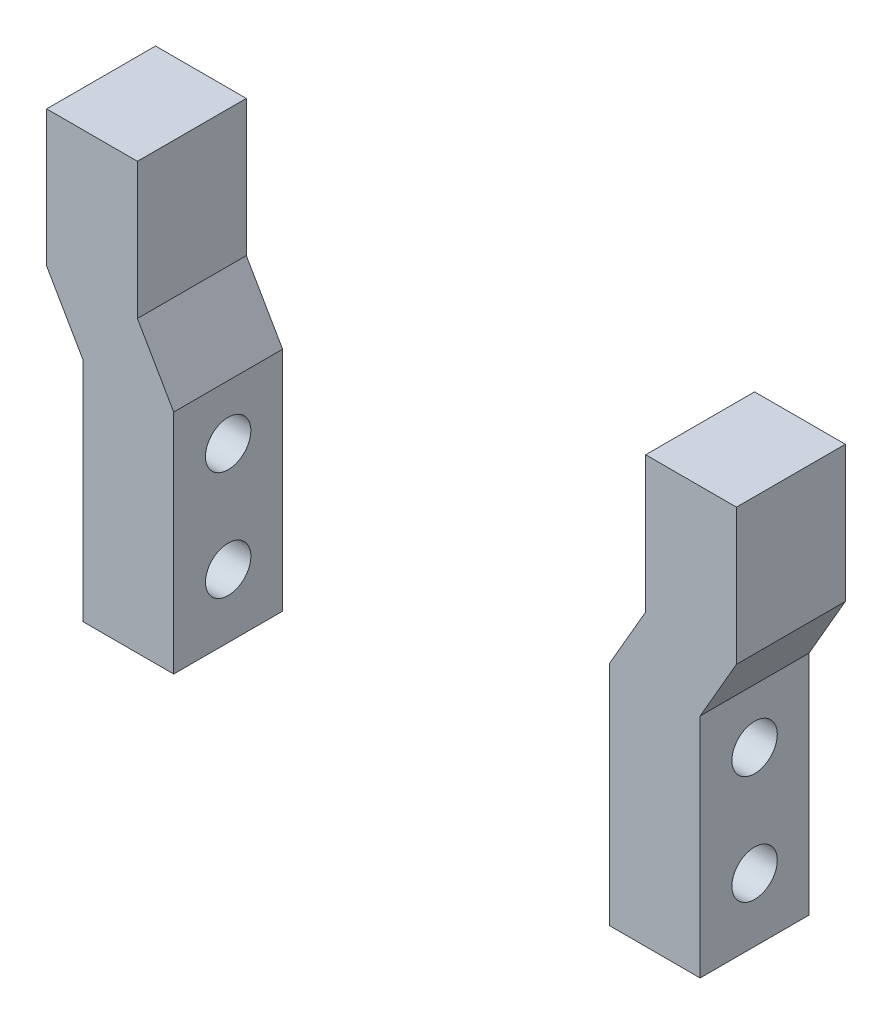
ISO-10303-21;
HEADER;
FILE_DESCRIPTION(('STEP AP214'),'2;1');
FILE_NAME('part.step','',(''),(''),'','','');
FILE_SCHEMA(('AUTOMOTIVE_DESIGN { 1 0 10303 214 1 1 1 1 }'));
ENDSEC;
DATA;
#1=APPLICATION_CONTEXT('core data for automotive mechanical design processes');
#2=APPLICATION_PROTOCOL_DEFINITION('international standard','automotive_design',2000,#1);
#3=PRODUCT_CONTEXT('',#1,'mechanical');
#4=PRODUCT('Part','Part','',(#3));
#5=PRODUCT_RELATED_PRODUCT_CATEGORY('part','',(#4));
#6=PRODUCT_DEFINITION_FORMATION('','',#4);
#7=PRODUCT_DEFINITION_CONTEXT('part definition',#1,'design');
#8=PRODUCT_DEFINITION('design','',#6,#7);
#9=PRODUCT_DEFINITION_SHAPE('','',#8);
#10=(LENGTH_UNIT() NAMED_UNIT(*) SI_UNIT(.MILLI.,.METRE.));
#11=(NAMED_UNIT(*) PLANE_ANGLE_UNIT() SI_UNIT($,.RADIAN.));
#12=(NAMED_UNIT(*) SI_UNIT($,.STERADIAN.) SOLID_ANGLE_UNIT());
#13=UNCERTAINTY_MEASURE_WITH_UNIT(LENGTH_MEASURE(1.E-05),#10,'distance_accuracy_value','');
#14=(GEOMETRIC_REPRESENTATION_CONTEXT(3) GLOBAL_UNCERTAINTY_ASSIGNED_CONTEXT((#13)) GLOBAL_UNIT_ASSIGNED_CONTEXT((#10,
#11,#12)) REPRESENTATION_CONTEXT('',''));
#15=CARTESIAN_POINT('',(0.,0.,0.));
#16=DIRECTION('',(0.,0.,1.));
#17=DIRECTION('',(1.,0.,0.));
#18=AXIS2_PLACEMENT_3D('',#15,#16,#17);
#19=CARTESIAN_POINT('',(4.47729176549357,2.58496560604824,12.));
#20=DIRECTION('',(0.866025403784436,0.500000000000004,0.));
#21=DIRECTION('',(-0.500000000000004,0.866025403784436,0.));
#22=AXIS2_PLACEMENT_3D('',#19,#20,#21);
#23=PLANE('',#22);
#24=DIRECTION('',(0.500000000000004,-0.866025403784436,0.));
#25=VECTOR('',#24,1.);
#26=CARTESIAN_POINT('',(4.47729176549357,2.58496560604824,0.));
#27=LINE('',#26,#25);
#28=CARTESIAN_POINT('',(-13.8986183628246,34.4129755836144,0.));
#29=VERTEX_POINT('',#28);
#30=CARTESIAN_POINT('',(-9.89861836282457,27.484772353339,0.));
#31=VERTEX_POINT('',#30);
#32=EDGE_CURVE('E143',#29,#31,#27,.T.);
#33=ORIENTED_EDGE('',*,*,#32,.F.);
#34=DIRECTION('',(0.,0.,-1.));
#35=VECTOR('',#34,1.);
#36=CARTESIAN_POINT('',(-13.8986183628246,34.4129755836144,12.));
#37=LINE('',#36,#35);
#38=CARTESIAN_POINT('',(-13.8986183628246,34.4129755836144,12.));
#39=VERTEX_POINT('',#38);
#40=EDGE_CURVE('E12',#39,#29,#37,.T.);
#41=ORIENTED_EDGE('',*,*,#40,.F.);
#42=DIRECTION('',(0.500000000000004,-0.866025403784436,0.));
#43=VECTOR('',#42,1.);
#44=CARTESIAN_POINT('',(4.47729176549357,2.58496560604824,12.));
#45=LINE('',#44,#43);
#46=CARTESIAN_POINT('',(-9.89861836282457,27.484772353339,12.));
#47=VERTEX_POINT('',#46);
#48=EDGE_CURVE('E163',#39,#47,#45,.T.);
#49=ORIENTED_EDGE('',*,*,#48,.T.);
#50=DIRECTION('',(0.,0.,-1.));
#51=VECTOR('',#50,1.);
#52=CARTESIAN_POINT('',(-9.89861836282457,27.484772353339,12.));
#53=LINE('',#52,#51);
#54=EDGE_CURVE('E99',#47,#31,#53,.T.);
#55=ORIENTED_EDGE('',*,*,#54,.T.);
#56=EDGE_LOOP('',(#33,#41,#49,#55));
#57=FACE_BOUND('',#56,.T.);
#58=ADVANCED_FACE('F49',(#57),#23,.T.);
#59=CARTESIAN_POINT('',(-13.8986183628245,0.,12.));
#60=DIRECTION('',(1.,0.,0.));
#61=DIRECTION('',(0.,1.,0.));
#62=AXIS2_PLACEMENT_3D('',#59,#60,#61);
#63=PLANE('',#62);
#64=DIRECTION('',(0.,-1.,0.));
#65=VECTOR('',#64,1.);
#66=CARTESIAN_POINT('',(-13.8986183628245,0.,0.));
#67=LINE('',#66,#65);
#68=CARTESIAN_POINT('',(-13.8986183628246,49.4129755836144,0.));
#69=VERTEX_POINT('',#68);
#70=EDGE_CURVE('E146',#69,#29,#67,.T.);
#71=ORIENTED_EDGE('',*,*,#70,.F.);
#72=DIRECTION('',(0.,0.,-1.));
#73=VECTOR('',#72,1.);
#74=CARTESIAN_POINT('',(-13.8986183628246,49.4129755836144,12.));
#75=LINE('',#74,#73);
#76=CARTESIAN_POINT('',(-13.8986183628246,49.4129755836144,12.));
#77=VERTEX_POINT('',#76);
#78=EDGE_CURVE('E57',#77,#69,#75,.T.);
#79=ORIENTED_EDGE('',*,*,#78,.F.);
#80=DIRECTION('',(0.,-1.,0.));
#81=VECTOR('',#80,1.);
#82=CARTESIAN_POINT('',(-13.8986183628245,0.,12.));
#83=LINE('',#82,#81);
#84=EDGE_CURVE('E188',#77,#39,#83,.T.);
#85=ORIENTED_EDGE('',*,*,#84,.T.);
#86=ORIENTED_EDGE('',*,*,#40,.T.);
#87=EDGE_LOOP('',(#71,#79,#85,#86));
#88=FACE_BOUND('',#87,.T.);
#89=ADVANCED_FACE('F180',(#88),#63,.T.);
#90=CARTESIAN_POINT('',(1.13147560366849E-12,49.4129755836141,12.));
#91=DIRECTION('',(0.,1.,0.));
#92=DIRECTION('',(-1.,0.,0.));
#93=AXIS2_PLACEMENT_3D('',#90,#91,#92);
#94=PLANE('',#93);
#95=DIRECTION('',(1.,0.,0.));
#96=VECTOR('',#95,1.);
#97=CARTESIAN_POINT('',(1.13147560366849E-12,49.4129755836141,0.));
#98=LINE('',#97,#96);
#99=CARTESIAN_POINT('',(-23.8986183628246,49.4129755836147,0.));
#100=VERTEX_POINT('',#99);
#101=EDGE_CURVE('E150',#100,#69,#98,.T.);
#102=ORIENTED_EDGE('',*,*,#101,.F.);
#103=DIRECTION('',(0.,0.,-1.));
#104=VECTOR('',#103,1.);
#105=CARTESIAN_POINT('',(-23.8986183628246,49.4129755836147,12.));
#106=LINE('',#105,#104);
#107=CARTESIAN_POINT('',(-23.8986183628246,49.4129755836147,12.));
#108=VERTEX_POINT('',#107);
#109=EDGE_CURVE('E169',#108,#100,#106,.T.);
#110=ORIENTED_EDGE('',*,*,#109,.F.);
#111=DIRECTION('',(1.,0.,0.));
#112=VECTOR('',#111,1.);
#113=CARTESIAN_POINT('',(1.13147560366849E-12,49.4129755836141,12.));
#114=LINE('',#113,#112);
#115=EDGE_CURVE('E176',#108,#77,#114,.T.);
#116=ORIENTED_EDGE('',*,*,#115,.T.);
#117=ORIENTED_EDGE('',*,*,#78,.T.);
#118=EDGE_LOOP('',(#102,#110,#116,#117));
#119=FACE_BOUND('',#118,.T.);
#120=ADVANCED_FACE('F174',(#119),#94,.T.);
#121=CARTESIAN_POINT('',(-23.8986183628246,0.,12.));
#122=DIRECTION('',(-1.,0.,0.));
#123=DIRECTION('',(0.,-1.,0.));
#124=AXIS2_PLACEMENT_3D('',#121,#122,#123);
#125=PLANE('',#124);
#126=DIRECTION('',(0.,1.,0.));
#127=VECTOR('',#126,1.);
#128=CARTESIAN_POINT('',(-23.8986183628246,0.,0.));
#129=LINE('',#128,#127);
#130=CARTESIAN_POINT('',(-23.8986183628246,34.4129755836144,0.));
#131=VERTEX_POINT('',#130);
#132=EDGE_CURVE('E153',#131,#100,#129,.T.);
#133=ORIENTED_EDGE('',*,*,#132,.F.);
#134=DIRECTION('',(0.,0.,-1.));
#135=VECTOR('',#134,1.);
#136=CARTESIAN_POINT('',(-23.8986183628246,34.4129755836144,12.));
#137=LINE('',#136,#135);
#138=CARTESIAN_POINT('',(-23.8986183628246,34.4129755836144,12.));
#139=VERTEX_POINT('',#138);
#140=EDGE_CURVE('E167',#139,#131,#137,.T.);
#141=ORIENTED_EDGE('',*,*,#140,.F.);
#142=DIRECTION('',(0.,1.,0.));
#143=VECTOR('',#142,1.);
#144=CARTESIAN_POINT('',(-23.8986183628246,0.,12.));
#145=LINE('',#144,#143);
#146=EDGE_CURVE('E138',#139,#108,#145,.T.);
#147=ORIENTED_EDGE('',*,*,#146,.T.);
#148=ORIENTED_EDGE('',*,*,#109,.T.);
#149=EDGE_LOOP('',(#133,#141,#147,#148));
#150=FACE_BOUND('',#149,.T.);
#151=ADVANCED_FACE('F186',(#150),#125,.T.);
#152=CARTESIAN_POINT('',(-3.02270823450636,-1.74516141287397,12.));
#153=DIRECTION('',(-0.866025403784436,-0.500000000000005,0.));
#154=DIRECTION('',(0.500000000000005,-0.866025403784436,0.));
#155=AXIS2_PLACEMENT_3D('',#152,#153,#154);
#156=PLANE('',#155);
#157=DIRECTION('',(-0.500000000000005,0.866025403784436,0.));
#158=VECTOR('',#157,1.);
#159=CARTESIAN_POINT('',(-3.02270823450636,-1.74516141287397,0.));
#160=LINE('',#159,#158);
#161=CARTESIAN_POINT('',(-19.8986183628246,27.484772353339,0.));
#162=VERTEX_POINT('',#161);
#163=EDGE_CURVE('E156',#162,#131,#160,.T.);
#164=ORIENTED_EDGE('',*,*,#163,.F.);
#165=DIRECTION('',(0.,0.,-1.));
#166=VECTOR('',#165,1.);
#167=CARTESIAN_POINT('',(-19.8986183628246,27.484772353339,12.));
#168=LINE('',#167,#166);
#169=CARTESIAN_POINT('',(-19.8986183628246,27.484772353339,12.));
#170=VERTEX_POINT('',#169);
#171=EDGE_CURVE('E126',#170,#162,#168,.T.);
#172=ORIENTED_EDGE('',*,*,#171,.F.);
#173=DIRECTION('',(-0.500000000000005,0.866025403784436,0.));
#174=VECTOR('',#173,1.);
#175=CARTESIAN_POINT('',(-3.02270823450636,-1.74516141287397,12.));
#176=LINE('',#175,#174);
#177=EDGE_CURVE('E136',#170,#139,#176,.T.);
#178=ORIENTED_EDGE('',*,*,#177,.T.);
#179=ORIENTED_EDGE('',*,*,#140,.T.);
#180=EDGE_LOOP('',(#164,#172,#178,#179));
#181=FACE_BOUND('',#180,.T.);
#182=ADVANCED_FACE('F225',(#181),#156,.T.);
#183=CARTESIAN_POINT('',(-19.8986183628246,0.,12.));
#184=DIRECTION('',(-1.,0.,0.));
#185=DIRECTION('',(0.,0.,1.));
#186=AXIS2_PLACEMENT_3D('',#183,#184,#185);
#187=PLANE('',#186);
#188=CARTESIAN_POINT('',(-19.8986183628246,9.484772353339,6.));
#189=DIRECTION('',(-1.,0.,0.));
#190=DIRECTION('',(0.,0.,1.));
#191=AXIS2_PLACEMENT_3D('',#188,#189,#190);
#192=CIRCLE('',#191,2.5);
#193=CARTESIAN_POINT('',(-19.8986183628246,9.484772353339,8.5));
#194=VERTEX_POINT('',#193);
#195=EDGE_CURVE('E199',#194,#194,#192,.F.);
#196=ORIENTED_EDGE('',*,*,#195,.T.);
#197=EDGE_LOOP('',(#196));
#198=FACE_BOUND('',#197,.T.);
#199=CARTESIAN_POINT('',(-19.8986183628246,21.484772353339,6.));
#200=DIRECTION('',(-1.,0.,0.));
#201=DIRECTION('',(0.,0.,1.));
#202=AXIS2_PLACEMENT_3D('',#199,#200,#201);
#203=CIRCLE('',#202,2.5);
#204=CARTESIAN_POINT('',(-19.8986183628246,21.484772353339,8.5));
#205=VERTEX_POINT('',#204);
#206=EDGE_CURVE('E193',#205,#205,#203,.F.);
#207=ORIENTED_EDGE('',*,*,#206,.T.);
#208=EDGE_LOOP('',(#207));
#209=FACE_BOUND('',#208,.T.);
#210=DIRECTION('',(0.,1.,0.));
#211=VECTOR('',#210,1.);
#212=CARTESIAN_POINT('',(-19.8986183628246,0.,0.));
#213=LINE('',#212,#211);
#214=CARTESIAN_POINT('',(-19.8986183628246,2.484772353339,0.));
#215=VERTEX_POINT('',#214);
#216=EDGE_CURVE('E125',#215,#162,#213,.T.);
#217=ORIENTED_EDGE('',*,*,#216,.F.);
#218=DIRECTION('',(0.,0.,-1.));
#219=VECTOR('',#218,1.);
#220=CARTESIAN_POINT('',(-19.8986183628246,2.484772353339,12.));
#221=LINE('',#220,#219);
#222=CARTESIAN_POINT('',(-19.8986183628246,2.484772353339,12.));
#223=VERTEX_POINT('',#222);
#224=EDGE_CURVE('E119',#223,#215,#221,.T.);
#225=ORIENTED_EDGE('',*,*,#224,.F.);
#226=DIRECTION('',(0.,1.,0.));
#227=VECTOR('',#226,1.);
#228=CARTESIAN_POINT('',(-19.8986183628246,0.,12.));
#229=LINE('',#228,#227);
#230=EDGE_CURVE('E123',#223,#170,#229,.T.);
#231=ORIENTED_EDGE('',*,*,#230,.T.);
#232=ORIENTED_EDGE('',*,*,#171,.T.);
#233=EDGE_LOOP('',(#217,#225,#231,#232));
#234=FACE_BOUND('',#233,.T.);
#235=ADVANCED_FACE('F121',(#198,#209,#234),#187,.T.);
#236=CARTESIAN_POINT('',(0.,2.48477235333901,12.));
#237=DIRECTION('',(0.,1.,0.));
#238=DIRECTION('',(-1.,0.,0.));
#239=AXIS2_PLACEMENT_3D('',#236,#237,#238);
#240=PLANE('',#239);
#241=DIRECTION('',(1.,0.,0.));
#242=VECTOR('',#241,1.);
#243=CARTESIAN_POINT('',(0.,2.48477235333901,0.));
#244=LINE('',#243,#242);
#245=CARTESIAN_POINT('',(-9.89861836282456,2.48477235333901,0.));
#246=VERTEX_POINT('',#245);
#247=EDGE_CURVE('E92',#215,#246,#244,.T.);
#248=ORIENTED_EDGE('',*,*,#247,.T.);
#249=DIRECTION('',(0.,0.,-1.));
#250=VECTOR('',#249,1.);
#251=CARTESIAN_POINT('',(-9.89861836282456,2.48477235333901,12.));
#252=LINE('',#251,#250);
#253=CARTESIAN_POINT('',(-9.89861836282456,2.48477235333901,12.));
#254=VERTEX_POINT('',#253);
#255=EDGE_CURVE('E127',#254,#246,#252,.T.);
#256=ORIENTED_EDGE('',*,*,#255,.F.);
#257=DIRECTION('',(1.,0.,0.));
#258=VECTOR('',#257,1.);
#259=CARTESIAN_POINT('',(0.,2.48477235333901,12.));
#260=LINE('',#259,#258);
#261=EDGE_CURVE('E129',#223,#254,#260,.T.);
#262=ORIENTED_EDGE('',*,*,#261,.F.);
#263=ORIENTED_EDGE('',*,*,#224,.T.);
#264=EDGE_LOOP('',(#248,#256,#262,#263));
#265=FACE_BOUND('',#264,.T.);
#266=ADVANCED_FACE('F130',(#265),#240,.F.);
#267=CARTESIAN_POINT('',(-9.89861836282456,0.,12.));
#268=DIRECTION('',(-1.,0.,0.));
#269=DIRECTION('',(0.,-1.,0.));
#270=AXIS2_PLACEMENT_3D('',#267,#268,#269);
#271=PLANE('',#270);
#272=CARTESIAN_POINT('',(-9.89861836282456,9.484772353339,6.));
#273=DIRECTION('',(1.,0.,0.));
#274=DIRECTION('',(0.,1.,0.));
#275=AXIS2_PLACEMENT_3D('',#272,#273,#274);
#276=CIRCLE('',#275,2.5);
#277=CARTESIAN_POINT('',(-9.89861836282456,11.984772353339,6.));
#278=VERTEX_POINT('',#277);
#279=EDGE_CURVE('E196',#278,#278,#276,.T.);
#280=ORIENTED_EDGE('',*,*,#279,.F.);
#281=EDGE_LOOP('',(#280));
#282=FACE_BOUND('',#281,.T.);
#283=CARTESIAN_POINT('',(-9.89861836282457,21.484772353339,6.));
#284=DIRECTION('',(1.,0.,0.));
#285=DIRECTION('',(0.,1.,0.));
#286=AXIS2_PLACEMENT_3D('',#283,#284,#285);
#287=CIRCLE('',#286,2.5);
#288=CARTESIAN_POINT('',(-9.89861836282457,23.984772353339,6.));
#289=VERTEX_POINT('',#288);
#290=EDGE_CURVE('E147',#289,#289,#287,.T.);
#291=ORIENTED_EDGE('',*,*,#290,.F.);
#292=EDGE_LOOP('',(#291));
#293=FACE_BOUND('',#292,.T.);
#294=DIRECTION('',(0.,1.,0.));
#295=VECTOR('',#294,1.);
#296=CARTESIAN_POINT('',(-9.89861836282456,0.,0.));
#297=LINE('',#296,#295);
#298=EDGE_CURVE('E161',#246,#31,#297,.T.);
#299=ORIENTED_EDGE('',*,*,#298,.T.);
#300=ORIENTED_EDGE('',*,*,#54,.F.);
#301=DIRECTION('',(0.,1.,0.));
#302=VECTOR('',#301,1.);
#303=CARTESIAN_POINT('',(-9.89861836282456,0.,12.));
#304=LINE('',#303,#302);
#305=EDGE_CURVE('E65',#254,#47,#304,.T.);
#306=ORIENTED_EDGE('',*,*,#305,.F.);
#307=ORIENTED_EDGE('',*,*,#255,.T.);
#308=EDGE_LOOP('',(#299,#300,#306,#307));
#309=FACE_BOUND('',#308,.T.);
#310=ADVANCED_FACE('F207',(#282,#293,#309),#271,.F.);
#311=CARTESIAN_POINT('',(0.,0.,12.));
#312=DIRECTION('',(0.,0.,1.));
#313=DIRECTION('',(1.,0.,0.));
#314=AXIS2_PLACEMENT_3D('',#311,#312,#313);
#315=PLANE('',#314);
#316=ORIENTED_EDGE('',*,*,#48,.F.);
#317=ORIENTED_EDGE('',*,*,#84,.F.);
#318=ORIENTED_EDGE('',*,*,#115,.F.);
#319=ORIENTED_EDGE('',*,*,#146,.F.);
#320=ORIENTED_EDGE('',*,*,#177,.F.);
#321=ORIENTED_EDGE('',*,*,#230,.F.);
#322=ORIENTED_EDGE('',*,*,#261,.T.);
#323=ORIENTED_EDGE('',*,*,#305,.T.);
#324=EDGE_LOOP('',(#316,#317,#318,#319,#320,#321,#322,#323));
#325=FACE_BOUND('',#324,.T.);
#326=ADVANCED_FACE('F133',(#325),#315,.T.);
#327=CARTESIAN_POINT('',(0.,0.,0.));
#328=DIRECTION('',(0.,0.,1.));
#329=DIRECTION('',(1.,0.,0.));
#330=AXIS2_PLACEMENT_3D('',#327,#328,#329);
#331=PLANE('',#330);
#332=ORIENTED_EDGE('',*,*,#32,.T.);
#333=ORIENTED_EDGE('',*,*,#298,.F.);
#334=ORIENTED_EDGE('',*,*,#247,.F.);
#335=ORIENTED_EDGE('',*,*,#216,.T.);
#336=ORIENTED_EDGE('',*,*,#163,.T.);
#337=ORIENTED_EDGE('',*,*,#132,.T.);
#338=ORIENTED_EDGE('',*,*,#101,.T.);
#339=ORIENTED_EDGE('',*,*,#70,.T.);
#340=EDGE_LOOP('',(#332,#333,#334,#335,#336,#337,#338,#339));
#341=FACE_BOUND('',#340,.T.);
#342=ADVANCED_FACE('F182',(#341),#331,.F.);
#343=CARTESIAN_POINT('',(-23.8996183628246,21.484772353339,6.));
#344=DIRECTION('',(1.,0.,0.));
#345=DIRECTION('',(0.,1.,0.));
#346=AXIS2_PLACEMENT_3D('',#343,#344,#345);
#347=CYLINDRICAL_SURFACE('',#346,2.5);
#348=ORIENTED_EDGE('',*,*,#206,.F.);
#349=EDGE_LOOP('',(#348));
#350=FACE_BOUND('',#349,.T.);
#351=ORIENTED_EDGE('',*,*,#290,.T.);
#352=EDGE_LOOP('',(#351));
#353=FACE_BOUND('',#352,.T.);
#354=ADVANCED_FACE('F236',(#350,#353),#347,.F.);
#355=CARTESIAN_POINT('',(-23.8996183628246,9.484772353339,6.));
#356=DIRECTION('',(1.,0.,0.));
#357=DIRECTION('',(0.,1.,0.));
#358=AXIS2_PLACEMENT_3D('',#355,#356,#357);
#359=CYLINDRICAL_SURFACE('',#358,2.5);
#360=ORIENTED_EDGE('',*,*,#195,.F.);
#361=EDGE_LOOP('',(#360));
#362=FACE_BOUND('',#361,.T.);
#363=ORIENTED_EDGE('',*,*,#279,.T.);
#364=EDGE_LOOP('',(#363));
#365=FACE_BOUND('',#364,.T.);
#366=ADVANCED_FACE('F205',(#362,#365),#359,.F.);
#367=CLOSED_SHELL('',(#58,#89,#120,#151,#182,#235,#266,#310,#326,#342,#354,#366));
#368=MANIFOLD_SOLID_BREP('B2',#367);
#369=CARTESIAN_POINT('',(42.1013816371754,49.4129755836147,12.));
#370=DIRECTION('',(1.,0.,0.));
#371=DIRECTION('',(0.,0.,-1.));
#372=AXIS2_PLACEMENT_3D('',#369,#370,#371);
#373=PLANE('',#372);
#374=DIRECTION('',(0.,-1.,0.));
#375=VECTOR('',#374,1.);
#376=CARTESIAN_POINT('',(42.1013816371754,49.4129755836147,0.));
#377=LINE('',#376,#375);
#378=CARTESIAN_POINT('',(42.1013816371754,49.4129755836147,0.));
#379=VERTEX_POINT('',#378);
#380=CARTESIAN_POINT('',(42.1013816371754,34.4129755836144,0.));
#381=VERTEX_POINT('',#380);
#382=EDGE_CURVE('E419',#379,#381,#377,.T.);
#383=ORIENTED_EDGE('',*,*,#382,.T.);
#384=DIRECTION('',(0.,0.,-1.));
#385=VECTOR('',#384,1.);
#386=CARTESIAN_POINT('',(42.1013816371754,34.4129755836144,12.));
#387=LINE('',#386,#385);
#388=CARTESIAN_POINT('',(42.1013816371754,34.4129755836144,12.));
#389=VERTEX_POINT('',#388);
#390=EDGE_CURVE('E47',#389,#381,#387,.T.);
#391=ORIENTED_EDGE('',*,*,#390,.F.);
#392=DIRECTION('',(0.,-1.,0.));
#393=VECTOR('',#392,1.);
#394=CARTESIAN_POINT('',(42.1013816371754,49.4129755836147,12.));
#395=LINE('',#394,#393);
#396=CARTESIAN_POINT('',(42.1013816371754,49.4129755836147,12.));
#397=VERTEX_POINT('',#396);
#398=EDGE_CURVE('E437',#397,#389,#395,.T.);
#399=ORIENTED_EDGE('',*,*,#398,.F.);
#400=DIRECTION('',(0.,0.,-1.));
#401=VECTOR('',#400,1.);
#402=CARTESIAN_POINT('',(42.1013816371754,49.4129755836147,12.));
#403=LINE('',#402,#401);
#404=EDGE_CURVE('E415',#397,#379,#403,.T.);
#405=ORIENTED_EDGE('',*,*,#404,.T.);
#406=EDGE_LOOP('',(#383,#391,#399,#405));
#407=FACE_BOUND('',#406,.T.);
#408=ADVANCED_FACE('F322',(#407),#373,.F.);
#409=CARTESIAN_POINT('',(42.1013816371754,34.4129755836144,12.));
#410=DIRECTION('',(0.866025403784436,-0.500000000000005,0.));
#411=DIRECTION('',(0.500000000000005,0.866025403784436,0.));
#412=AXIS2_PLACEMENT_3D('',#409,#410,#411);
#413=PLANE('',#412);
#414=DIRECTION('',(-0.500000000000005,-0.866025403784436,0.));
#415=VECTOR('',#414,1.);
#416=CARTESIAN_POINT('',(42.1013816371754,34.4129755836144,0.));
#417=LINE('',#416,#415);
#418=CARTESIAN_POINT('',(38.1013816371755,27.484772353339,0.));
#419=VERTEX_POINT('',#418);
#420=EDGE_CURVE('E422',#381,#419,#417,.T.);
#421=ORIENTED_EDGE('',*,*,#420,.T.);
#422=DIRECTION('',(0.,0.,-1.));
#423=VECTOR('',#422,1.);
#424=CARTESIAN_POINT('',(38.1013816371755,27.484772353339,12.));
#425=LINE('',#424,#423);
#426=CARTESIAN_POINT('',(38.1013816371755,27.484772353339,12.));
#427=VERTEX_POINT('',#426);
#428=EDGE_CURVE('E330',#427,#419,#425,.T.);
#429=ORIENTED_EDGE('',*,*,#428,.F.);
#430=DIRECTION('',(-0.500000000000005,-0.866025403784436,0.));
#431=VECTOR('',#430,1.);
#432=CARTESIAN_POINT('',(42.1013816371754,34.4129755836144,12.));
#433=LINE('',#432,#431);
#434=EDGE_CURVE('E381',#389,#427,#433,.T.);
#435=ORIENTED_EDGE('',*,*,#434,.F.);
#436=ORIENTED_EDGE('',*,*,#390,.T.);
#437=EDGE_LOOP('',(#421,#429,#435,#436));
#438=FACE_BOUND('',#437,.T.);
#439=ADVANCED_FACE('F450',(#438),#413,.F.);
#440=CARTESIAN_POINT('',(38.1013816371755,2.48477235333901,12.));
#441=DIRECTION('',(-1.,0.,0.));
#442=DIRECTION('',(0.,0.,1.));
#443=AXIS2_PLACEMENT_3D('',#440,#441,#442);
#444=PLANE('',#443);
#445=CARTESIAN_POINT('',(38.1013816371755,9.484772353339,6.));
#446=DIRECTION('',(-1.,0.,0.));
#447=DIRECTION('',(0.,0.,1.));
#448=AXIS2_PLACEMENT_3D('',#445,#446,#447);
#449=CIRCLE('',#448,2.5);
#450=CARTESIAN_POINT('',(38.1013816371755,9.484772353339,8.5));
#451=VERTEX_POINT('',#450);
#452=EDGE_CURVE('E472',#451,#451,#449,.F.);
#453=ORIENTED_EDGE('',*,*,#452,.T.);
#454=EDGE_LOOP('',(#453));
#455=FACE_BOUND('',#454,.T.);
#456=CARTESIAN_POINT('',(38.1013816371755,21.484772353339,6.));
#457=DIRECTION('',(-1.,0.,0.));
#458=DIRECTION('',(0.,0.,1.));
#459=AXIS2_PLACEMENT_3D('',#456,#457,#458);
#460=CIRCLE('',#459,2.5);
#461=CARTESIAN_POINT('',(38.1013816371755,21.484772353339,8.5));
#462=VERTEX_POINT('',#461);
#463=EDGE_CURVE('E466',#462,#462,#460,.F.);
#464=ORIENTED_EDGE('',*,*,#463,.T.);
#465=EDGE_LOOP('',(#464));
#466=FACE_BOUND('',#465,.T.);
#467=DIRECTION('',(0.,1.,0.));
#468=VECTOR('',#467,1.);
#469=CARTESIAN_POINT('',(38.1013816371755,2.48477235333901,0.));
#470=LINE('',#469,#468);
#471=CARTESIAN_POINT('',(38.1013816371755,2.48477235333901,0.));
#472=VERTEX_POINT('',#471);
#473=EDGE_CURVE('E426',#472,#419,#470,.T.);
#474=ORIENTED_EDGE('',*,*,#473,.F.);
#475=DIRECTION('',(0.,0.,-1.));
#476=VECTOR('',#475,1.);
#477=CARTESIAN_POINT('',(38.1013816371755,2.48477235333901,12.));
#478=LINE('',#477,#476);
#479=CARTESIAN_POINT('',(38.1013816371755,2.48477235333901,12.));
#480=VERTEX_POINT('',#479);
#481=EDGE_CURVE('E443',#480,#472,#478,.T.);
#482=ORIENTED_EDGE('',*,*,#481,.F.);
#483=DIRECTION('',(0.,1.,0.));
#484=VECTOR('',#483,1.);
#485=CARTESIAN_POINT('',(38.1013816371755,2.48477235333901,12.));
#486=LINE('',#485,#484);
#487=EDGE_CURVE('E449',#480,#427,#486,.T.);
#488=ORIENTED_EDGE('',*,*,#487,.T.);
#489=ORIENTED_EDGE('',*,*,#428,.T.);
#490=EDGE_LOOP('',(#474,#482,#488,#489));
#491=FACE_BOUND('',#490,.T.);
#492=ADVANCED_FACE('F447',(#455,#466,#491),#444,.T.);
#493=CARTESIAN_POINT('',(48.1013816371754,2.484772353339,12.));
#494=DIRECTION('',(0.,-1.,0.));
#495=DIRECTION('',(1.,0.,0.));
#496=AXIS2_PLACEMENT_3D('',#493,#494,#495);
#497=PLANE('',#496);
#498=DIRECTION('',(-1.,0.,0.));
#499=VECTOR('',#498,1.);
#500=CARTESIAN_POINT('',(48.1013816371754,2.484772353339,0.));
#501=LINE('',#500,#499);
#502=CARTESIAN_POINT('',(48.1013816371754,2.484772353339,0.));
#503=VERTEX_POINT('',#502);
#504=EDGE_CURVE('E429',#503,#472,#501,.T.);
#505=ORIENTED_EDGE('',*,*,#504,.F.);
#506=DIRECTION('',(0.,0.,-1.));
#507=VECTOR('',#506,1.);
#508=CARTESIAN_POINT('',(48.1013816371754,2.484772353339,12.));
#509=LINE('',#508,#507);
#510=CARTESIAN_POINT('',(48.1013816371754,2.484772353339,12.));
#511=VERTEX_POINT('',#510);
#512=EDGE_CURVE('E441',#511,#503,#509,.T.);
#513=ORIENTED_EDGE('',*,*,#512,.F.);
#514=DIRECTION('',(-1.,0.,0.));
#515=VECTOR('',#514,1.);
#516=CARTESIAN_POINT('',(48.1013816371754,2.484772353339,12.));
#517=LINE('',#516,#515);
#518=EDGE_CURVE('E460',#511,#480,#517,.T.);
#519=ORIENTED_EDGE('',*,*,#518,.T.);
#520=ORIENTED_EDGE('',*,*,#481,.T.);
#521=EDGE_LOOP('',(#505,#513,#519,#520));
#522=FACE_BOUND('',#521,.T.);
#523=ADVANCED_FACE('F458',(#522),#497,.T.);
#524=CARTESIAN_POINT('',(48.1013816371754,2.484772353339,12.));
#525=DIRECTION('',(-1.,0.,0.));
#526=DIRECTION('',(0.,0.,1.));
#527=AXIS2_PLACEMENT_3D('',#524,#525,#526);
#528=PLANE('',#527);
#529=CARTESIAN_POINT('',(48.1013816371754,9.484772353339,6.));
#530=DIRECTION('',(1.,0.,0.));
#531=DIRECTION('',(0.,0.,-1.));
#532=AXIS2_PLACEMENT_3D('',#529,#530,#531);
#533=CIRCLE('',#532,2.5);
#534=CARTESIAN_POINT('',(48.1013816371754,9.484772353339,3.5));
#535=VERTEX_POINT('',#534);
#536=EDGE_CURVE('E469',#535,#535,#533,.T.);
#537=ORIENTED_EDGE('',*,*,#536,.F.);
#538=EDGE_LOOP('',(#537));
#539=FACE_BOUND('',#538,.T.);
#540=CARTESIAN_POINT('',(48.1013816371754,21.484772353339,6.));
#541=DIRECTION('',(1.,0.,0.));
#542=DIRECTION('',(0.,0.,-1.));
#543=AXIS2_PLACEMENT_3D('',#540,#541,#542);
#544=CIRCLE('',#543,2.5);
#545=CARTESIAN_POINT('',(48.1013816371754,21.484772353339,3.5));
#546=VERTEX_POINT('',#545);
#547=EDGE_CURVE('E423',#546,#546,#544,.T.);
#548=ORIENTED_EDGE('',*,*,#547,.F.);
#549=EDGE_LOOP('',(#548));
#550=FACE_BOUND('',#549,.T.);
#551=DIRECTION('',(0.,1.,0.));
#552=VECTOR('',#551,1.);
#553=CARTESIAN_POINT('',(48.1013816371754,2.484772353339,0.));
#554=LINE('',#553,#552);
#555=CARTESIAN_POINT('',(48.1013816371754,27.484772353339,0.));
#556=VERTEX_POINT('',#555);
#557=EDGE_CURVE('E432',#503,#556,#554,.T.);
#558=ORIENTED_EDGE('',*,*,#557,.T.);
#559=DIRECTION('',(0.,0.,-1.));
#560=VECTOR('',#559,1.);
#561=CARTESIAN_POINT('',(48.1013816371754,27.484772353339,12.));
#562=LINE('',#561,#560);
#563=CARTESIAN_POINT('',(48.1013816371754,27.484772353339,12.));
#564=VERTEX_POINT('',#563);
#565=EDGE_CURVE('E410',#564,#556,#562,.T.);
#566=ORIENTED_EDGE('',*,*,#565,.F.);
#567=DIRECTION('',(0.,1.,0.));
#568=VECTOR('',#567,1.);
#569=CARTESIAN_POINT('',(48.1013816371754,2.484772353339,12.));
#570=LINE('',#569,#568);
#571=EDGE_CURVE('E401',#511,#564,#570,.T.);
#572=ORIENTED_EDGE('',*,*,#571,.F.);
#573=ORIENTED_EDGE('',*,*,#512,.T.);
#574=EDGE_LOOP('',(#558,#566,#572,#573));
#575=FACE_BOUND('',#574,.T.);
#576=ADVANCED_FACE('F480',(#539,#550,#575),#528,.F.);
#577=CARTESIAN_POINT('',(48.1013816371754,27.484772353339,12.));
#578=DIRECTION('',(-0.866025403784435,0.500000000000007,0.));
#579=DIRECTION('',(-0.500000000000007,-0.866025403784435,0.));
#580=AXIS2_PLACEMENT_3D('',#577,#578,#579);
#581=PLANE('',#580);
#582=DIRECTION('',(0.500000000000007,0.866025403784435,0.));
#583=VECTOR('',#582,1.);
#584=CARTESIAN_POINT('',(48.1013816371754,27.484772353339,0.));
#585=LINE('',#584,#583);
#586=CARTESIAN_POINT('',(52.1013816371755,34.4129755836144,0.));
#587=VERTEX_POINT('',#586);
#588=EDGE_CURVE('E409',#556,#587,#585,.T.);
#589=ORIENTED_EDGE('',*,*,#588,.T.);
#590=DIRECTION('',(0.,0.,-1.));
#591=VECTOR('',#590,1.);
#592=CARTESIAN_POINT('',(52.1013816371755,34.4129755836144,12.));
#593=LINE('',#592,#591);
#594=CARTESIAN_POINT('',(52.1013816371755,34.4129755836144,12.));
#595=VERTEX_POINT('',#594);
#596=EDGE_CURVE('E406',#595,#587,#593,.T.);
#597=ORIENTED_EDGE('',*,*,#596,.F.);
#598=DIRECTION('',(0.500000000000007,0.866025403784435,0.));
#599=VECTOR('',#598,1.);
#600=CARTESIAN_POINT('',(48.1013816371754,27.484772353339,12.));
#601=LINE('',#600,#599);
#602=EDGE_CURVE('E394',#564,#595,#601,.T.);
#603=ORIENTED_EDGE('',*,*,#602,.F.);
#604=ORIENTED_EDGE('',*,*,#565,.T.);
#605=EDGE_LOOP('',(#589,#597,#603,#604));
#606=FACE_BOUND('',#605,.T.);
#607=ADVANCED_FACE('F407',(#606),#581,.F.);
#608=CARTESIAN_POINT('',(52.1013816371755,34.4129755836144,12.));
#609=DIRECTION('',(-1.,0.,0.));
#610=DIRECTION('',(0.,-1.,0.));
#611=AXIS2_PLACEMENT_3D('',#608,#609,#610);
#612=PLANE('',#611);
#613=DIRECTION('',(0.,1.,0.));
#614=VECTOR('',#613,1.);
#615=CARTESIAN_POINT('',(52.1013816371755,34.4129755836144,0.));
#616=LINE('',#615,#614);
#617=CARTESIAN_POINT('',(52.1013816371754,49.4129755836147,0.));
#618=VERTEX_POINT('',#617);
#619=EDGE_CURVE('E367',#587,#618,#616,.T.);
#620=ORIENTED_EDGE('',*,*,#619,.T.);
#621=DIRECTION('',(0.,0.,-1.));
#622=VECTOR('',#621,1.);
#623=CARTESIAN_POINT('',(52.1013816371754,49.4129755836147,12.));
#624=LINE('',#623,#622);
#625=CARTESIAN_POINT('',(52.1013816371754,49.4129755836147,12.));
#626=VERTEX_POINT('',#625);
#627=EDGE_CURVE('E411',#626,#618,#624,.T.);
#628=ORIENTED_EDGE('',*,*,#627,.F.);
#629=DIRECTION('',(0.,1.,0.));
#630=VECTOR('',#629,1.);
#631=CARTESIAN_POINT('',(52.1013816371755,34.4129755836144,12.));
#632=LINE('',#631,#630);
#633=EDGE_CURVE('E398',#595,#626,#632,.T.);
#634=ORIENTED_EDGE('',*,*,#633,.F.);
#635=ORIENTED_EDGE('',*,*,#596,.T.);
#636=EDGE_LOOP('',(#620,#628,#634,#635));
#637=FACE_BOUND('',#636,.T.);
#638=ADVANCED_FACE('F413',(#637),#612,.F.);
#639=CARTESIAN_POINT('',(52.1013816371754,49.4129755836147,12.));
#640=DIRECTION('',(0.,-1.,0.));
#641=DIRECTION('',(1.,0.,0.));
#642=AXIS2_PLACEMENT_3D('',#639,#640,#641);
#643=PLANE('',#642);
#644=DIRECTION('',(-1.,0.,0.));
#645=VECTOR('',#644,1.);
#646=CARTESIAN_POINT('',(52.1013816371754,49.4129755836147,0.));
#647=LINE('',#646,#645);
#648=EDGE_CURVE('E373',#618,#379,#647,.T.);
#649=ORIENTED_EDGE('',*,*,#648,.T.);
#650=ORIENTED_EDGE('',*,*,#404,.F.);
#651=DIRECTION('',(-1.,0.,0.));
#652=VECTOR('',#651,1.);
#653=CARTESIAN_POINT('',(52.1013816371754,49.4129755836147,12.));
#654=LINE('',#653,#652);
#655=EDGE_CURVE('E338',#626,#397,#654,.T.);
#656=ORIENTED_EDGE('',*,*,#655,.F.);
#657=ORIENTED_EDGE('',*,*,#627,.T.);
#658=EDGE_LOOP('',(#649,#650,#656,#657));
#659=FACE_BOUND('',#658,.T.);
#660=ADVANCED_FACE('F488',(#659),#643,.F.);
#661=CARTESIAN_POINT('',(0.,0.,12.));
#662=DIRECTION('',(0.,0.,-1.));
#663=DIRECTION('',(-1.,0.,0.));
#664=AXIS2_PLACEMENT_3D('',#661,#662,#663);
#665=PLANE('',#664);
#666=ORIENTED_EDGE('',*,*,#398,.T.);
#667=ORIENTED_EDGE('',*,*,#434,.T.);
#668=ORIENTED_EDGE('',*,*,#487,.F.);
#669=ORIENTED_EDGE('',*,*,#518,.F.);
#670=ORIENTED_EDGE('',*,*,#571,.T.);
#671=ORIENTED_EDGE('',*,*,#602,.T.);
#672=ORIENTED_EDGE('',*,*,#633,.T.);
#673=ORIENTED_EDGE('',*,*,#655,.T.);
#674=EDGE_LOOP('',(#666,#667,#668,#669,#670,#671,#672,#673));
#675=FACE_BOUND('',#674,.T.);
#676=ADVANCED_FACE('F396',(#675),#665,.F.);
#677=CARTESIAN_POINT('',(0.,0.,0.));
#678=DIRECTION('',(0.,0.,-1.));
#679=DIRECTION('',(-1.,0.,0.));
#680=AXIS2_PLACEMENT_3D('',#677,#678,#679);
#681=PLANE('',#680);
#682=ORIENTED_EDGE('',*,*,#382,.F.);
#683=ORIENTED_EDGE('',*,*,#648,.F.);
#684=ORIENTED_EDGE('',*,*,#619,.F.);
#685=ORIENTED_EDGE('',*,*,#588,.F.);
#686=ORIENTED_EDGE('',*,*,#557,.F.);
#687=ORIENTED_EDGE('',*,*,#504,.T.);
#688=ORIENTED_EDGE('',*,*,#473,.T.);
#689=ORIENTED_EDGE('',*,*,#420,.F.);
#690=EDGE_LOOP('',(#682,#683,#684,#685,#686,#687,#688,#689));
#691=FACE_BOUND('',#690,.T.);
#692=ADVANCED_FACE('F454',(#691),#681,.T.);
#693=CARTESIAN_POINT('',(-23.8996183628246,21.484772353339,6.));
#694=DIRECTION('',(1.,0.,0.));
#695=DIRECTION('',(0.,0.,-1.));
#696=AXIS2_PLACEMENT_3D('',#693,#694,#695);
#697=CYLINDRICAL_SURFACE('',#696,2.5);
#698=ORIENTED_EDGE('',*,*,#463,.F.);
#699=EDGE_LOOP('',(#698));
#700=FACE_BOUND('',#699,.T.);
#701=ORIENTED_EDGE('',*,*,#547,.T.);
#702=EDGE_LOOP('',(#701));
#703=FACE_BOUND('',#702,.T.);
#704=ADVANCED_FACE('F539',(#700,#703),#697,.F.);
#705=CARTESIAN_POINT('',(-23.8996183628246,9.484772353339,6.));
#706=DIRECTION('',(1.,0.,0.));
#707=DIRECTION('',(0.,0.,-1.));
#708=AXIS2_PLACEMENT_3D('',#705,#706,#707);
#709=CYLINDRICAL_SURFACE('',#708,2.5);
#710=ORIENTED_EDGE('',*,*,#452,.F.);
#711=EDGE_LOOP('',(#710));
#712=FACE_BOUND('',#711,.T.);
#713=ORIENTED_EDGE('',*,*,#536,.T.);
#714=EDGE_LOOP('',(#713));
#715=FACE_BOUND('',#714,.T.);
#716=ADVANCED_FACE('F478',(#712,#715),#709,.F.);
#717=CLOSED_SHELL('',(#408,#439,#492,#523,#576,#607,#638,#660,#676,#692,#704,#716));
#718=MANIFOLD_SOLID_BREP('B6',#717);
#719=ADVANCED_BREP_SHAPE_REPRESENTATION('',(#18,#368,#718),#14);
#720=SHAPE_DEFINITION_REPRESENTATION(#9,#719);
ENDSEC;
END-ISO-10303-21;
